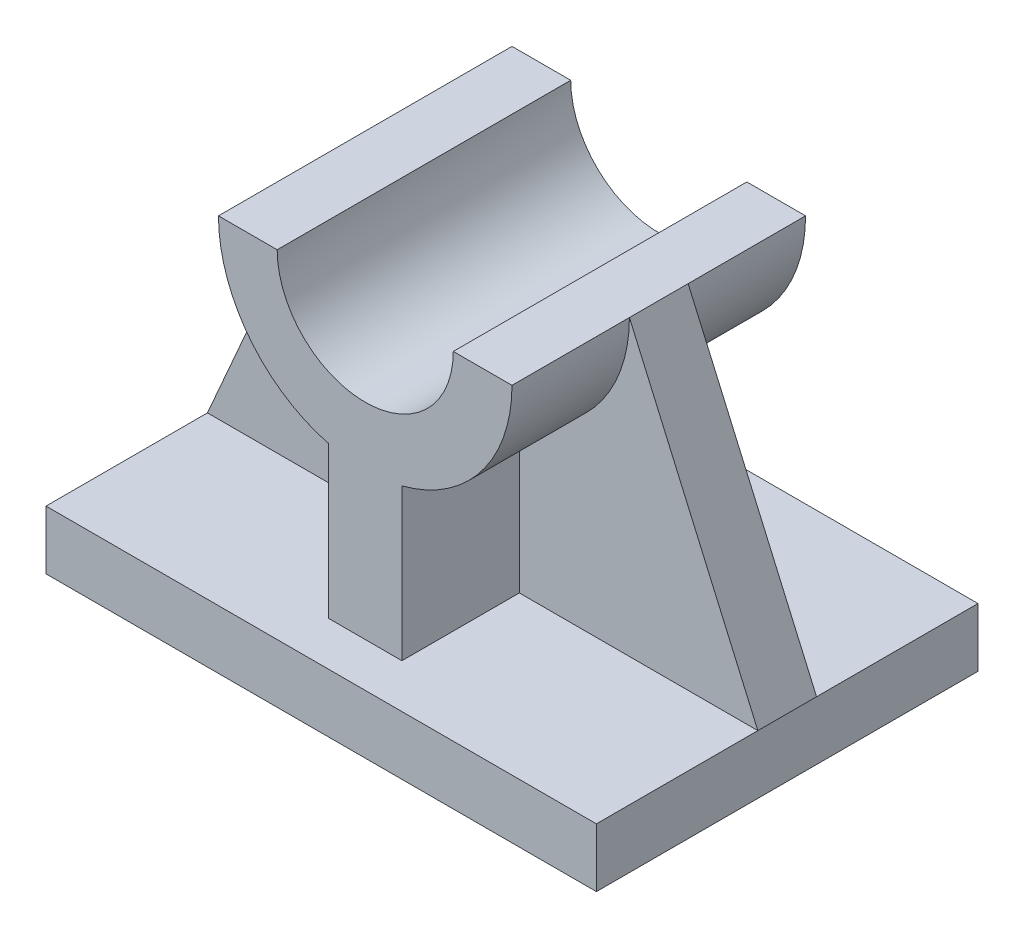
ISO-10303-21;
HEADER;
FILE_DESCRIPTION(('STEP AP214'),'2;1');
FILE_NAME('part.step','',(''),(''),'','','');
FILE_SCHEMA(('AUTOMOTIVE_DESIGN { 1 0 10303 214 1 1 1 1 }'));
ENDSEC;
DATA;
#1=APPLICATION_CONTEXT('core data for automotive mechanical design processes');
#2=APPLICATION_PROTOCOL_DEFINITION('international standard','automotive_design',2000,#1);
#3=PRODUCT_CONTEXT('',#1,'mechanical');
#4=PRODUCT('Part','Part','',(#3));
#5=PRODUCT_RELATED_PRODUCT_CATEGORY('part','',(#4));
#6=PRODUCT_DEFINITION_FORMATION('','',#4);
#7=PRODUCT_DEFINITION_CONTEXT('part definition',#1,'design');
#8=PRODUCT_DEFINITION('design','',#6,#7);
#9=PRODUCT_DEFINITION_SHAPE('','',#8);
#10=(LENGTH_UNIT() NAMED_UNIT(*) SI_UNIT(.MILLI.,.METRE.));
#11=(NAMED_UNIT(*) PLANE_ANGLE_UNIT() SI_UNIT($,.RADIAN.));
#12=(NAMED_UNIT(*) SI_UNIT($,.STERADIAN.) SOLID_ANGLE_UNIT());
#13=UNCERTAINTY_MEASURE_WITH_UNIT(LENGTH_MEASURE(1.E-05),#10,'distance_accuracy_value','');
#14=(GEOMETRIC_REPRESENTATION_CONTEXT(3) GLOBAL_UNCERTAINTY_ASSIGNED_CONTEXT((#13)) GLOBAL_UNIT_ASSIGNED_CONTEXT((#10,
#11,#12)) REPRESENTATION_CONTEXT('',''));
#15=CARTESIAN_POINT('',(0.,0.,0.));
#16=DIRECTION('',(0.,0.,1.));
#17=DIRECTION('',(1.,0.,0.));
#18=AXIS2_PLACEMENT_3D('',#15,#16,#17);
#19=CARTESIAN_POINT('',(0.,4.,26.));
#20=DIRECTION('',(0.,1.,0.));
#21=DIRECTION('',(0.,0.,1.));
#22=AXIS2_PLACEMENT_3D('',#19,#20,#21);
#23=PLANE('',#22);
#24=DIRECTION('',(0.,0.,-1.));
#25=VECTOR('',#24,1.);
#26=CARTESIAN_POINT('',(-37.5,4.,26.));
#27=LINE('',#26,#25);
#28=CARTESIAN_POINT('',(-37.5,4.,-3.99999999999999));
#29=VERTEX_POINT('',#28);
#30=CARTESIAN_POINT('',(-37.5,4.,-26.));
#31=VERTEX_POINT('',#30);
#32=EDGE_CURVE('E56',#29,#31,#27,.T.);
#33=ORIENTED_EDGE('',*,*,#32,.F.);
#34=DIRECTION('',(1.,0.,0.));
#35=VECTOR('',#34,1.);
#36=CARTESIAN_POINT('',(0.,4.,-4.));
#37=LINE('',#36,#35);
#38=CARTESIAN_POINT('',(-5.,4.,-4.));
#39=VERTEX_POINT('',#38);
#40=EDGE_CURVE('E192',#29,#39,#37,.T.);
#41=ORIENTED_EDGE('',*,*,#40,.T.);
#42=DIRECTION('',(0.,0.,-1.));
#43=VECTOR('',#42,1.);
#44=CARTESIAN_POINT('',(-5.,4.,20.));
#45=LINE('',#44,#43);
#46=CARTESIAN_POINT('',(-5.,4.,-20.));
#47=VERTEX_POINT('',#46);
#48=EDGE_CURVE('E179',#39,#47,#45,.T.);
#49=ORIENTED_EDGE('',*,*,#48,.T.);
#50=DIRECTION('',(1.,0.,0.));
#51=VECTOR('',#50,1.);
#52=CARTESIAN_POINT('',(0.,4.,-20.));
#53=LINE('',#52,#51);
#54=CARTESIAN_POINT('',(5.,4.,-20.));
#55=VERTEX_POINT('',#54);
#56=EDGE_CURVE('E243',#47,#55,#53,.T.);
#57=ORIENTED_EDGE('',*,*,#56,.T.);
#58=DIRECTION('',(0.,0.,-1.));
#59=VECTOR('',#58,1.);
#60=CARTESIAN_POINT('',(5.,4.,20.));
#61=LINE('',#60,#59);
#62=CARTESIAN_POINT('',(5.,4.,-4.));
#63=VERTEX_POINT('',#62);
#64=EDGE_CURVE('E259',#63,#55,#61,.T.);
#65=ORIENTED_EDGE('',*,*,#64,.F.);
#66=DIRECTION('',(1.,0.,0.));
#67=VECTOR('',#66,1.);
#68=CARTESIAN_POINT('',(0.,4.,-4.));
#69=LINE('',#68,#67);
#70=CARTESIAN_POINT('',(37.5,4.,-4.));
#71=VERTEX_POINT('',#70);
#72=EDGE_CURVE('E229',#63,#71,#69,.T.);
#73=ORIENTED_EDGE('',*,*,#72,.T.);
#74=DIRECTION('',(0.,0.,-1.));
#75=VECTOR('',#74,1.);
#76=CARTESIAN_POINT('',(37.5,4.,26.));
#77=LINE('',#76,#75);
#78=CARTESIAN_POINT('',(37.5,4.,-26.));
#79=VERTEX_POINT('',#78);
#80=EDGE_CURVE('E325',#71,#79,#77,.T.);
#81=ORIENTED_EDGE('',*,*,#80,.T.);
#82=DIRECTION('',(1.,0.,0.));
#83=VECTOR('',#82,1.);
#84=CARTESIAN_POINT('',(0.,4.,-26.));
#85=LINE('',#84,#83);
#86=EDGE_CURVE('E318',#31,#79,#85,.T.);
#87=ORIENTED_EDGE('',*,*,#86,.F.);
#88=EDGE_LOOP('',(#33,#41,#49,#57,#65,#73,#81,#87));
#89=FACE_BOUND('',#88,.T.);
#90=ADVANCED_FACE('F41',(#89),#23,.T.);
#91=CARTESIAN_POINT('',(0.,44.,20.));
#92=DIRECTION('',(0.,0.,-1.));
#93=DIRECTION('',(-1.,0.,0.));
#94=AXIS2_PLACEMENT_3D('',#91,#92,#93);
#95=CYLINDRICAL_SURFACE('',#94,20.);
#96=CARTESIAN_POINT('',(0.,44.,-4.));
#97=DIRECTION('',(0.,0.,1.));
#98=DIRECTION('',(1.,0.,0.));
#99=AXIS2_PLACEMENT_3D('',#96,#97,#98);
#100=CIRCLE('',#99,20.);
#101=CARTESIAN_POINT('',(-20.,44.,-4.));
#102=VERTEX_POINT('',#101);
#103=CARTESIAN_POINT('',(-5.,24.6350832689629,-4.));
#104=VERTEX_POINT('',#103);
#105=EDGE_CURVE('E200',#102,#104,#100,.T.);
#106=ORIENTED_EDGE('',*,*,#105,.F.);
#107=DIRECTION('',(0.,0.,-1.));
#108=VECTOR('',#107,1.);
#109=CARTESIAN_POINT('',(-20.,44.,20.));
#110=LINE('',#109,#108);
#111=CARTESIAN_POINT('',(-20.,44.,-20.));
#112=VERTEX_POINT('',#111);
#113=EDGE_CURVE('E283',#102,#112,#110,.T.);
#114=ORIENTED_EDGE('',*,*,#113,.T.);
#115=CARTESIAN_POINT('',(0.,44.,-20.));
#116=DIRECTION('',(0.,0.,1.));
#117=DIRECTION('',(1.,0.,0.));
#118=AXIS2_PLACEMENT_3D('',#115,#116,#117);
#119=CIRCLE('',#118,20.);
#120=CARTESIAN_POINT('',(-5.,24.6350832689629,-20.));
#121=VERTEX_POINT('',#120);
#122=EDGE_CURVE('E266',#112,#121,#119,.T.);
#123=ORIENTED_EDGE('',*,*,#122,.T.);
#124=DIRECTION('',(0.,0.,-1.));
#125=VECTOR('',#124,1.);
#126=CARTESIAN_POINT('',(-5.,24.6350832689629,20.));
#127=LINE('',#126,#125);
#128=EDGE_CURVE('E279',#104,#121,#127,.T.);
#129=ORIENTED_EDGE('',*,*,#128,.F.);
#130=EDGE_LOOP('',(#106,#114,#123,#129));
#131=FACE_BOUND('',#130,.T.);
#132=ADVANCED_FACE('F390',(#131),#95,.T.);
#133=CARTESIAN_POINT('',(-5.,0.,20.));
#134=DIRECTION('',(1.,0.,0.));
#135=DIRECTION('',(0.,1.,0.));
#136=AXIS2_PLACEMENT_3D('',#133,#134,#135);
#137=PLANE('',#136);
#138=DIRECTION('',(0.,-1.,0.));
#139=VECTOR('',#138,1.);
#140=CARTESIAN_POINT('',(-5.,0.,-4.));
#141=LINE('',#140,#139);
#142=EDGE_CURVE('E182',#104,#39,#141,.T.);
#143=ORIENTED_EDGE('',*,*,#142,.F.);
#144=ORIENTED_EDGE('',*,*,#128,.T.);
#145=DIRECTION('',(0.,-1.,0.));
#146=VECTOR('',#145,1.);
#147=CARTESIAN_POINT('',(-5.,0.,-20.));
#148=LINE('',#147,#146);
#149=EDGE_CURVE('E185',#121,#47,#148,.T.);
#150=ORIENTED_EDGE('',*,*,#149,.T.);
#151=ORIENTED_EDGE('',*,*,#48,.F.);
#152=EDGE_LOOP('',(#143,#144,#150,#151));
#153=FACE_BOUND('',#152,.T.);
#154=ADVANCED_FACE('F180',(#153),#137,.F.);
#155=CARTESIAN_POINT('',(5.,0.,20.));
#156=DIRECTION('',(1.,0.,0.));
#157=DIRECTION('',(0.,1.,0.));
#158=AXIS2_PLACEMENT_3D('',#155,#156,#157);
#159=PLANE('',#158);
#160=DIRECTION('',(0.,0.,-1.));
#161=VECTOR('',#160,1.);
#162=CARTESIAN_POINT('',(5.,24.6350832689629,20.));
#163=LINE('',#162,#161);
#164=CARTESIAN_POINT('',(5.,24.6350832689629,-4.));
#165=VERTEX_POINT('',#164);
#166=CARTESIAN_POINT('',(5.,24.6350832689629,-20.));
#167=VERTEX_POINT('',#166);
#168=EDGE_CURVE('E295',#165,#167,#163,.T.);
#169=ORIENTED_EDGE('',*,*,#168,.F.);
#170=DIRECTION('',(0.,-1.,0.));
#171=VECTOR('',#170,1.);
#172=CARTESIAN_POINT('',(5.,0.,-4.));
#173=LINE('',#172,#171);
#174=EDGE_CURVE('E226',#165,#63,#173,.T.);
#175=ORIENTED_EDGE('',*,*,#174,.T.);
#176=ORIENTED_EDGE('',*,*,#64,.T.);
#177=DIRECTION('',(0.,-1.,0.));
#178=VECTOR('',#177,1.);
#179=CARTESIAN_POINT('',(5.,0.,-20.));
#180=LINE('',#179,#178);
#181=EDGE_CURVE('E238',#167,#55,#180,.T.);
#182=ORIENTED_EDGE('',*,*,#181,.F.);
#183=EDGE_LOOP('',(#169,#175,#176,#182));
#184=FACE_BOUND('',#183,.T.);
#185=ADVANCED_FACE('F420',(#184),#159,.T.);
#186=CARTESIAN_POINT('',(0.,44.,-4.));
#187=DIRECTION('',(0.,0.,1.));
#188=DIRECTION('',(1.,0.,0.));
#189=AXIS2_PLACEMENT_3D('',#186,#187,#188);
#190=CIRCLE('',#189,20.);
#191=CARTESIAN_POINT('',(20.,44.,-4.));
#192=VERTEX_POINT('',#191);
#193=EDGE_CURVE('E213',#165,#192,#190,.T.);
#194=ORIENTED_EDGE('',*,*,#193,.F.);
#195=ORIENTED_EDGE('',*,*,#168,.T.);
#196=CARTESIAN_POINT('',(20.,44.,-20.));
#197=VERTEX_POINT('',#196);
#198=EDGE_CURVE('E262',#167,#197,#119,.T.);
#199=ORIENTED_EDGE('',*,*,#198,.T.);
#200=DIRECTION('',(0.,0.,-1.));
#201=VECTOR('',#200,1.);
#202=CARTESIAN_POINT('',(20.,44.,20.));
#203=LINE('',#202,#201);
#204=EDGE_CURVE('E291',#192,#197,#203,.T.);
#205=ORIENTED_EDGE('',*,*,#204,.F.);
#206=EDGE_LOOP('',(#194,#195,#199,#205));
#207=FACE_BOUND('',#206,.T.);
#208=ADVANCED_FACE('F399',(#207),#95,.T.);
#209=CARTESIAN_POINT('',(0.,-4.,26.));
#210=DIRECTION('',(0.,1.,0.));
#211=DIRECTION('',(0.,0.,1.));
#212=AXIS2_PLACEMENT_3D('',#209,#210,#211);
#213=PLANE('',#212);
#214=DIRECTION('',(1.,0.,0.));
#215=VECTOR('',#214,1.);
#216=CARTESIAN_POINT('',(0.,-4.,-26.));
#217=LINE('',#216,#215);
#218=CARTESIAN_POINT('',(-37.5,-4.,-26.));
#219=VERTEX_POINT('',#218);
#220=CARTESIAN_POINT('',(37.5,-4.,-26.));
#221=VERTEX_POINT('',#220);
#222=EDGE_CURVE('E299',#219,#221,#217,.T.);
#223=ORIENTED_EDGE('',*,*,#222,.T.);
#224=DIRECTION('',(0.,0.,-1.));
#225=VECTOR('',#224,1.);
#226=CARTESIAN_POINT('',(37.5,-4.,26.));
#227=LINE('',#226,#225);
#228=CARTESIAN_POINT('',(37.5,-4.,26.));
#229=VERTEX_POINT('',#228);
#230=EDGE_CURVE('E11',#229,#221,#227,.T.);
#231=ORIENTED_EDGE('',*,*,#230,.F.);
#232=DIRECTION('',(1.,0.,0.));
#233=VECTOR('',#232,1.);
#234=CARTESIAN_POINT('',(0.,-4.,26.));
#235=LINE('',#234,#233);
#236=CARTESIAN_POINT('',(-37.5,-4.,26.));
#237=VERTEX_POINT('',#236);
#238=EDGE_CURVE('E300',#237,#229,#235,.T.);
#239=ORIENTED_EDGE('',*,*,#238,.F.);
#240=DIRECTION('',(0.,0.,-1.));
#241=VECTOR('',#240,1.);
#242=CARTESIAN_POINT('',(-37.5,-4.,26.));
#243=LINE('',#242,#241);
#244=EDGE_CURVE('E312',#237,#219,#243,.T.);
#245=ORIENTED_EDGE('',*,*,#244,.T.);
#246=EDGE_LOOP('',(#223,#231,#239,#245));
#247=FACE_BOUND('',#246,.T.);
#248=ADVANCED_FACE('F43',(#247),#213,.F.);
#249=CARTESIAN_POINT('',(37.5,0.,26.));
#250=DIRECTION('',(-1.,0.,0.));
#251=DIRECTION('',(0.,0.,1.));
#252=AXIS2_PLACEMENT_3D('',#249,#250,#251);
#253=PLANE('',#252);
#254=DIRECTION('',(0.,1.,0.));
#255=VECTOR('',#254,1.);
#256=CARTESIAN_POINT('',(37.5,0.,-26.));
#257=LINE('',#256,#255);
#258=EDGE_CURVE('E315',#221,#79,#257,.T.);
#259=ORIENTED_EDGE('',*,*,#258,.T.);
#260=ORIENTED_EDGE('',*,*,#80,.F.);
#261=DIRECTION('',(0.,0.,-1.));
#262=VECTOR('',#261,1.);
#263=CARTESIAN_POINT('',(37.5,4.,4.));
#264=LINE('',#263,#262);
#265=CARTESIAN_POINT('',(37.5,4.,4.));
#266=VERTEX_POINT('',#265);
#267=EDGE_CURVE('E236',#266,#71,#264,.T.);
#268=ORIENTED_EDGE('',*,*,#267,.F.);
#269=CARTESIAN_POINT('',(37.5,4.,26.));
#270=VERTEX_POINT('',#269);
#271=EDGE_CURVE('E49',#270,#266,#77,.T.);
#272=ORIENTED_EDGE('',*,*,#271,.F.);
#273=DIRECTION('',(0.,1.,0.));
#274=VECTOR('',#273,1.);
#275=CARTESIAN_POINT('',(37.5,0.,26.));
#276=LINE('',#275,#274);
#277=EDGE_CURVE('E303',#229,#270,#276,.T.);
#278=ORIENTED_EDGE('',*,*,#277,.F.);
#279=ORIENTED_EDGE('',*,*,#230,.T.);
#280=EDGE_LOOP('',(#259,#260,#268,#272,#278,#279));
#281=FACE_BOUND('',#280,.T.);
#282=ADVANCED_FACE('F333',(#281),#253,.F.);
#283=DIRECTION('',(1.,0.,0.));
#284=VECTOR('',#283,1.);
#285=CARTESIAN_POINT('',(0.,4.,4.));
#286=LINE('',#285,#284);
#287=CARTESIAN_POINT('',(-37.5,4.,4.00000000000001));
#288=VERTEX_POINT('',#287);
#289=CARTESIAN_POINT('',(-5.,4.,4.));
#290=VERTEX_POINT('',#289);
#291=EDGE_CURVE('E64',#288,#290,#286,.T.);
#292=ORIENTED_EDGE('',*,*,#291,.F.);
#293=CARTESIAN_POINT('',(-37.5,4.,26.));
#294=VERTEX_POINT('',#293);
#295=EDGE_CURVE('E324',#294,#288,#27,.T.);
#296=ORIENTED_EDGE('',*,*,#295,.F.);
#297=DIRECTION('',(1.,0.,0.));
#298=VECTOR('',#297,1.);
#299=CARTESIAN_POINT('',(0.,4.,26.));
#300=LINE('',#299,#298);
#301=EDGE_CURVE('E306',#294,#270,#300,.T.);
#302=ORIENTED_EDGE('',*,*,#301,.T.);
#303=ORIENTED_EDGE('',*,*,#271,.T.);
#304=DIRECTION('',(1.,0.,0.));
#305=VECTOR('',#304,1.);
#306=CARTESIAN_POINT('',(0.,4.,4.));
#307=LINE('',#306,#305);
#308=CARTESIAN_POINT('',(5.,4.,4.));
#309=VERTEX_POINT('',#308);
#310=EDGE_CURVE('E220',#309,#266,#307,.T.);
#311=ORIENTED_EDGE('',*,*,#310,.F.);
#312=CARTESIAN_POINT('',(5.,4.,20.));
#313=VERTEX_POINT('',#312);
#314=EDGE_CURVE('E189',#313,#309,#61,.T.);
#315=ORIENTED_EDGE('',*,*,#314,.F.);
#316=DIRECTION('',(1.,0.,0.));
#317=VECTOR('',#316,1.);
#318=CARTESIAN_POINT('',(0.,4.,20.));
#319=LINE('',#318,#317);
#320=CARTESIAN_POINT('',(-5.,4.,20.));
#321=VERTEX_POINT('',#320);
#322=EDGE_CURVE('E257',#321,#313,#319,.T.);
#323=ORIENTED_EDGE('',*,*,#322,.F.);
#324=EDGE_CURVE('E188',#321,#290,#45,.T.);
#325=ORIENTED_EDGE('',*,*,#324,.T.);
#326=EDGE_LOOP('',(#292,#296,#302,#303,#311,#315,#323,#325));
#327=FACE_BOUND('',#326,.T.);
#328=ADVANCED_FACE('F361',(#327),#23,.T.);
#329=CARTESIAN_POINT('',(-37.5,0.,26.));
#330=DIRECTION('',(-1.,0.,0.));
#331=DIRECTION('',(0.,0.,1.));
#332=AXIS2_PLACEMENT_3D('',#329,#330,#331);
#333=PLANE('',#332);
#334=DIRECTION('',(0.,1.,0.));
#335=VECTOR('',#334,1.);
#336=CARTESIAN_POINT('',(-37.5,0.,-26.));
#337=LINE('',#336,#335);
#338=EDGE_CURVE('E304',#219,#31,#337,.T.);
#339=ORIENTED_EDGE('',*,*,#338,.F.);
#340=ORIENTED_EDGE('',*,*,#244,.F.);
#341=DIRECTION('',(0.,1.,0.));
#342=VECTOR('',#341,1.);
#343=CARTESIAN_POINT('',(-37.5,0.,26.));
#344=LINE('',#343,#342);
#345=EDGE_CURVE('E309',#237,#294,#344,.T.);
#346=ORIENTED_EDGE('',*,*,#345,.T.);
#347=ORIENTED_EDGE('',*,*,#295,.T.);
#348=DIRECTION('',(0.,0.,-1.));
#349=VECTOR('',#348,1.);
#350=CARTESIAN_POINT('',(-37.5,4.,4.));
#351=LINE('',#350,#349);
#352=EDGE_CURVE('E207',#288,#29,#351,.T.);
#353=ORIENTED_EDGE('',*,*,#352,.T.);
#354=ORIENTED_EDGE('',*,*,#32,.T.);
#355=EDGE_LOOP('',(#339,#340,#346,#347,#353,#354));
#356=FACE_BOUND('',#355,.T.);
#357=ADVANCED_FACE('F340',(#356),#333,.T.);
#358=CARTESIAN_POINT('',(0.,0.,26.));
#359=DIRECTION('',(0.,0.,1.));
#360=DIRECTION('',(1.,0.,0.));
#361=AXIS2_PLACEMENT_3D('',#358,#359,#360);
#362=PLANE('',#361);
#363=ORIENTED_EDGE('',*,*,#238,.T.);
#364=ORIENTED_EDGE('',*,*,#277,.T.);
#365=ORIENTED_EDGE('',*,*,#301,.F.);
#366=ORIENTED_EDGE('',*,*,#345,.F.);
#367=EDGE_LOOP('',(#363,#364,#365,#366));
#368=FACE_BOUND('',#367,.T.);
#369=ADVANCED_FACE('F412',(#368),#362,.T.);
#370=CARTESIAN_POINT('',(0.,0.,-26.));
#371=DIRECTION('',(0.,0.,1.));
#372=DIRECTION('',(1.,0.,0.));
#373=AXIS2_PLACEMENT_3D('',#370,#371,#372);
#374=PLANE('',#373);
#375=ORIENTED_EDGE('',*,*,#222,.F.);
#376=ORIENTED_EDGE('',*,*,#338,.T.);
#377=ORIENTED_EDGE('',*,*,#86,.T.);
#378=ORIENTED_EDGE('',*,*,#258,.F.);
#379=EDGE_LOOP('',(#375,#376,#377,#378));
#380=FACE_BOUND('',#379,.T.);
#381=ADVANCED_FACE('F337',(#380),#374,.F.);
#382=DIRECTION('',(0.,-1.,0.));
#383=VECTOR('',#382,1.);
#384=CARTESIAN_POINT('',(5.,0.,4.));
#385=LINE('',#384,#383);
#386=CARTESIAN_POINT('',(5.,24.6350832689629,4.));
#387=VERTEX_POINT('',#386);
#388=EDGE_CURVE('E217',#387,#309,#385,.T.);
#389=ORIENTED_EDGE('',*,*,#388,.F.);
#390=CARTESIAN_POINT('',(5.,24.6350832689629,20.));
#391=VERTEX_POINT('',#390);
#392=EDGE_CURVE('E296',#391,#387,#163,.T.);
#393=ORIENTED_EDGE('',*,*,#392,.F.);
#394=DIRECTION('',(0.,-1.,0.));
#395=VECTOR('',#394,1.);
#396=CARTESIAN_POINT('',(5.,0.,20.));
#397=LINE('',#396,#395);
#398=EDGE_CURVE('E239',#391,#313,#397,.T.);
#399=ORIENTED_EDGE('',*,*,#398,.T.);
#400=ORIENTED_EDGE('',*,*,#314,.T.);
#401=EDGE_LOOP('',(#389,#393,#399,#400));
#402=FACE_BOUND('',#401,.T.);
#403=ADVANCED_FACE('F368',(#402),#159,.T.);
#404=ORIENTED_EDGE('',*,*,#392,.T.);
#405=CARTESIAN_POINT('',(0.,44.,4.));
#406=DIRECTION('',(0.,0.,1.));
#407=DIRECTION('',(1.,0.,0.));
#408=AXIS2_PLACEMENT_3D('',#405,#406,#407);
#409=CIRCLE('',#408,20.);
#410=CARTESIAN_POINT('',(20.,44.,4.));
#411=VERTEX_POINT('',#410);
#412=EDGE_CURVE('E214',#387,#411,#409,.T.);
#413=ORIENTED_EDGE('',*,*,#412,.T.);
#414=CARTESIAN_POINT('',(20.,44.,20.));
#415=VERTEX_POINT('',#414);
#416=EDGE_CURVE('E292',#415,#411,#203,.T.);
#417=ORIENTED_EDGE('',*,*,#416,.F.);
#418=CARTESIAN_POINT('',(0.,44.,20.));
#419=DIRECTION('',(0.,0.,1.));
#420=DIRECTION('',(1.,0.,0.));
#421=AXIS2_PLACEMENT_3D('',#418,#419,#420);
#422=CIRCLE('',#421,20.);
#423=EDGE_CURVE('E242',#391,#415,#422,.T.);
#424=ORIENTED_EDGE('',*,*,#423,.F.);
#425=EDGE_LOOP('',(#404,#413,#417,#424));
#426=FACE_BOUND('',#425,.T.);
#427=ADVANCED_FACE('F372',(#426),#95,.T.);
#428=CARTESIAN_POINT('',(0.,44.,20.));
#429=DIRECTION('',(0.,1.,0.));
#430=DIRECTION('',(0.,0.,1.));
#431=AXIS2_PLACEMENT_3D('',#428,#429,#430);
#432=PLANE('',#431);
#433=DIRECTION('',(1.,0.,0.));
#434=VECTOR('',#433,1.);
#435=CARTESIAN_POINT('',(0.,44.,-20.));
#436=LINE('',#435,#434);
#437=CARTESIAN_POINT('',(12.,44.,-20.));
#438=VERTEX_POINT('',#437);
#439=EDGE_CURVE('E265',#438,#197,#436,.T.);
#440=ORIENTED_EDGE('',*,*,#439,.F.);
#441=DIRECTION('',(0.,0.,-1.));
#442=VECTOR('',#441,1.);
#443=CARTESIAN_POINT('',(12.,44.,20.));
#444=LINE('',#443,#442);
#445=CARTESIAN_POINT('',(12.,44.,20.));
#446=VERTEX_POINT('',#445);
#447=EDGE_CURVE('E289',#446,#438,#444,.T.);
#448=ORIENTED_EDGE('',*,*,#447,.F.);
#449=DIRECTION('',(1.,0.,0.));
#450=VECTOR('',#449,1.);
#451=CARTESIAN_POINT('',(0.,44.,20.));
#452=LINE('',#451,#450);
#453=EDGE_CURVE('E245',#446,#415,#452,.T.);
#454=ORIENTED_EDGE('',*,*,#453,.T.);
#455=ORIENTED_EDGE('',*,*,#416,.T.);
#456=DIRECTION('',(0.,0.,-1.));
#457=VECTOR('',#456,1.);
#458=CARTESIAN_POINT('',(20.,44.,4.));
#459=LINE('',#458,#457);
#460=EDGE_CURVE('E224',#411,#192,#459,.T.);
#461=ORIENTED_EDGE('',*,*,#460,.T.);
#462=ORIENTED_EDGE('',*,*,#204,.T.);
#463=EDGE_LOOP('',(#440,#448,#454,#455,#461,#462));
#464=FACE_BOUND('',#463,.T.);
#465=ADVANCED_FACE('F401',(#464),#432,.T.);
#466=CARTESIAN_POINT('',(0.,44.,20.));
#467=DIRECTION('',(0.,0.,-1.));
#468=DIRECTION('',(-1.,0.,0.));
#469=AXIS2_PLACEMENT_3D('',#466,#467,#468);
#470=CYLINDRICAL_SURFACE('',#469,12.);
#471=CARTESIAN_POINT('',(0.,44.,-20.));
#472=DIRECTION('',(0.,0.,1.));
#473=DIRECTION('',(1.,0.,0.));
#474=AXIS2_PLACEMENT_3D('',#471,#472,#473);
#475=CIRCLE('',#474,12.);
#476=CARTESIAN_POINT('',(-12.,44.,-20.));
#477=VERTEX_POINT('',#476);
#478=EDGE_CURVE('E269',#477,#438,#475,.T.);
#479=ORIENTED_EDGE('',*,*,#478,.F.);
#480=DIRECTION('',(0.,0.,-1.));
#481=VECTOR('',#480,1.);
#482=CARTESIAN_POINT('',(-12.,44.,20.));
#483=LINE('',#482,#481);
#484=CARTESIAN_POINT('',(-12.,44.,20.));
#485=VERTEX_POINT('',#484);
#486=EDGE_CURVE('E287',#485,#477,#483,.T.);
#487=ORIENTED_EDGE('',*,*,#486,.F.);
#488=CARTESIAN_POINT('',(0.,44.,20.));
#489=DIRECTION('',(0.,0.,1.));
#490=DIRECTION('',(1.,0.,0.));
#491=AXIS2_PLACEMENT_3D('',#488,#489,#490);
#492=CIRCLE('',#491,12.);
#493=EDGE_CURVE('E249',#485,#446,#492,.T.);
#494=ORIENTED_EDGE('',*,*,#493,.T.);
#495=ORIENTED_EDGE('',*,*,#447,.T.);
#496=EDGE_LOOP('',(#479,#487,#494,#495));
#497=FACE_BOUND('',#496,.T.);
#498=ADVANCED_FACE('F379',(#497),#470,.F.);
#499=CARTESIAN_POINT('',(0.,44.,20.));
#500=DIRECTION('',(0.,1.,0.));
#501=DIRECTION('',(0.,0.,1.));
#502=AXIS2_PLACEMENT_3D('',#499,#500,#501);
#503=PLANE('',#502);
#504=DIRECTION('',(1.,0.,0.));
#505=VECTOR('',#504,1.);
#506=CARTESIAN_POINT('',(0.,44.,-20.));
#507=LINE('',#506,#505);
#508=EDGE_CURVE('E272',#112,#477,#507,.T.);
#509=ORIENTED_EDGE('',*,*,#508,.F.);
#510=ORIENTED_EDGE('',*,*,#113,.F.);
#511=DIRECTION('',(0.,0.,-1.));
#512=VECTOR('',#511,1.);
#513=CARTESIAN_POINT('',(-20.,44.,4.));
#514=LINE('',#513,#512);
#515=CARTESIAN_POINT('',(-20.,44.,4.));
#516=VERTEX_POINT('',#515);
#517=EDGE_CURVE('E209',#516,#102,#514,.T.);
#518=ORIENTED_EDGE('',*,*,#517,.F.);
#519=CARTESIAN_POINT('',(-20.,44.,20.));
#520=VERTEX_POINT('',#519);
#521=EDGE_CURVE('E284',#520,#516,#110,.T.);
#522=ORIENTED_EDGE('',*,*,#521,.F.);
#523=DIRECTION('',(1.,0.,0.));
#524=VECTOR('',#523,1.);
#525=CARTESIAN_POINT('',(0.,44.,20.));
#526=LINE('',#525,#524);
#527=EDGE_CURVE('E252',#520,#485,#526,.T.);
#528=ORIENTED_EDGE('',*,*,#527,.T.);
#529=ORIENTED_EDGE('',*,*,#486,.T.);
#530=EDGE_LOOP('',(#509,#510,#518,#522,#528,#529));
#531=FACE_BOUND('',#530,.T.);
#532=ADVANCED_FACE('F383',(#531),#503,.T.);
#533=ORIENTED_EDGE('',*,*,#521,.T.);
#534=CARTESIAN_POINT('',(0.,44.,4.));
#535=DIRECTION('',(0.,0.,1.));
#536=DIRECTION('',(1.,0.,0.));
#537=AXIS2_PLACEMENT_3D('',#534,#535,#536);
#538=CIRCLE('',#537,20.);
#539=CARTESIAN_POINT('',(-5.,24.6350832689629,4.));
#540=VERTEX_POINT('',#539);
#541=EDGE_CURVE('E201',#516,#540,#538,.T.);
#542=ORIENTED_EDGE('',*,*,#541,.T.);
#543=CARTESIAN_POINT('',(-5.,24.6350832689629,20.));
#544=VERTEX_POINT('',#543);
#545=EDGE_CURVE('E280',#544,#540,#127,.T.);
#546=ORIENTED_EDGE('',*,*,#545,.F.);
#547=EDGE_CURVE('E246',#520,#544,#422,.T.);
#548=ORIENTED_EDGE('',*,*,#547,.F.);
#549=EDGE_LOOP('',(#533,#542,#546,#548));
#550=FACE_BOUND('',#549,.T.);
#551=ADVANCED_FACE('F387',(#550),#95,.T.);
#552=ORIENTED_EDGE('',*,*,#545,.T.);
#553=DIRECTION('',(0.,-1.,0.));
#554=VECTOR('',#553,1.);
#555=CARTESIAN_POINT('',(-5.,0.,4.));
#556=LINE('',#555,#554);
#557=EDGE_CURVE('E210',#540,#290,#556,.T.);
#558=ORIENTED_EDGE('',*,*,#557,.T.);
#559=ORIENTED_EDGE('',*,*,#324,.F.);
#560=DIRECTION('',(0.,-1.,0.));
#561=VECTOR('',#560,1.);
#562=CARTESIAN_POINT('',(-5.,0.,20.));
#563=LINE('',#562,#561);
#564=EDGE_CURVE('E255',#544,#321,#563,.T.);
#565=ORIENTED_EDGE('',*,*,#564,.F.);
#566=EDGE_LOOP('',(#552,#558,#559,#565));
#567=FACE_BOUND('',#566,.T.);
#568=ADVANCED_FACE('F357',(#567),#137,.F.);
#569=CARTESIAN_POINT('',(0.,0.,20.));
#570=DIRECTION('',(0.,0.,1.));
#571=DIRECTION('',(1.,0.,0.));
#572=AXIS2_PLACEMENT_3D('',#569,#570,#571);
#573=PLANE('',#572);
#574=ORIENTED_EDGE('',*,*,#398,.F.);
#575=ORIENTED_EDGE('',*,*,#423,.T.);
#576=ORIENTED_EDGE('',*,*,#453,.F.);
#577=ORIENTED_EDGE('',*,*,#493,.F.);
#578=ORIENTED_EDGE('',*,*,#527,.F.);
#579=ORIENTED_EDGE('',*,*,#547,.T.);
#580=ORIENTED_EDGE('',*,*,#564,.T.);
#581=ORIENTED_EDGE('',*,*,#322,.T.);
#582=EDGE_LOOP('',(#574,#575,#576,#577,#578,#579,#580,#581));
#583=FACE_BOUND('',#582,.T.);
#584=ADVANCED_FACE('F365',(#583),#573,.T.);
#585=CARTESIAN_POINT('',(0.,0.,-20.));
#586=DIRECTION('',(0.,0.,1.));
#587=DIRECTION('',(1.,0.,0.));
#588=AXIS2_PLACEMENT_3D('',#585,#586,#587);
#589=PLANE('',#588);
#590=ORIENTED_EDGE('',*,*,#181,.T.);
#591=ORIENTED_EDGE('',*,*,#56,.F.);
#592=ORIENTED_EDGE('',*,*,#149,.F.);
#593=ORIENTED_EDGE('',*,*,#122,.F.);
#594=ORIENTED_EDGE('',*,*,#508,.T.);
#595=ORIENTED_EDGE('',*,*,#478,.T.);
#596=ORIENTED_EDGE('',*,*,#439,.T.);
#597=ORIENTED_EDGE('',*,*,#198,.F.);
#598=EDGE_LOOP('',(#590,#591,#592,#593,#594,#595,#596,#597));
#599=FACE_BOUND('',#598,.T.);
#600=ADVANCED_FACE('F439',(#599),#589,.F.);
#601=CARTESIAN_POINT('',(32.944262295082,14.4131147540984,4.));
#602=DIRECTION('',(-0.916157334902189,-0.400818834019708,0.));
#603=DIRECTION('',(0.400818834019708,-0.916157334902189,0.));
#604=AXIS2_PLACEMENT_3D('',#601,#602,#603);
#605=PLANE('',#604);
#606=DIRECTION('',(-0.400818834019708,0.916157334902189,0.));
#607=VECTOR('',#606,1.);
#608=CARTESIAN_POINT('',(32.944262295082,14.4131147540984,-4.));
#609=LINE('',#608,#607);
#610=EDGE_CURVE('E218',#71,#192,#609,.T.);
#611=ORIENTED_EDGE('',*,*,#610,.T.);
#612=ORIENTED_EDGE('',*,*,#460,.F.);
#613=DIRECTION('',(-0.400818834019708,0.916157334902189,0.));
#614=VECTOR('',#613,1.);
#615=CARTESIAN_POINT('',(32.944262295082,14.4131147540984,4.));
#616=LINE('',#615,#614);
#617=EDGE_CURVE('E222',#266,#411,#616,.T.);
#618=ORIENTED_EDGE('',*,*,#617,.F.);
#619=ORIENTED_EDGE('',*,*,#267,.T.);
#620=EDGE_LOOP('',(#611,#612,#618,#619));
#621=FACE_BOUND('',#620,.T.);
#622=ADVANCED_FACE('F428',(#621),#605,.F.);
#623=CARTESIAN_POINT('',(0.,0.,4.));
#624=DIRECTION('',(0.,0.,1.));
#625=DIRECTION('',(1.,0.,0.));
#626=AXIS2_PLACEMENT_3D('',#623,#624,#625);
#627=PLANE('',#626);
#628=ORIENTED_EDGE('',*,*,#412,.F.);
#629=ORIENTED_EDGE('',*,*,#388,.T.);
#630=ORIENTED_EDGE('',*,*,#310,.T.);
#631=ORIENTED_EDGE('',*,*,#617,.T.);
#632=EDGE_LOOP('',(#628,#629,#630,#631));
#633=FACE_BOUND('',#632,.T.);
#634=ADVANCED_FACE('F441',(#633),#627,.T.);
#635=CARTESIAN_POINT('',(0.,0.,-4.));
#636=DIRECTION('',(0.,0.,1.));
#637=DIRECTION('',(1.,0.,0.));
#638=AXIS2_PLACEMENT_3D('',#635,#636,#637);
#639=PLANE('',#638);
#640=ORIENTED_EDGE('',*,*,#193,.T.);
#641=ORIENTED_EDGE('',*,*,#610,.F.);
#642=ORIENTED_EDGE('',*,*,#72,.F.);
#643=ORIENTED_EDGE('',*,*,#174,.F.);
#644=EDGE_LOOP('',(#640,#641,#642,#643));
#645=FACE_BOUND('',#644,.T.);
#646=ADVANCED_FACE('F432',(#645),#639,.F.);
#647=CARTESIAN_POINT('',(-32.944262295082,14.4131147540984,4.));
#648=DIRECTION('',(-0.916157334902189,0.400818834019708,0.));
#649=DIRECTION('',(-0.400818834019708,-0.916157334902189,0.));
#650=AXIS2_PLACEMENT_3D('',#647,#648,#649);
#651=PLANE('',#650);
#652=DIRECTION('',(0.400818834019708,0.916157334902189,0.));
#653=VECTOR('',#652,1.);
#654=CARTESIAN_POINT('',(-32.944262295082,14.4131147540984,-4.));
#655=LINE('',#654,#653);
#656=EDGE_CURVE('E196',#29,#102,#655,.T.);
#657=ORIENTED_EDGE('',*,*,#656,.F.);
#658=ORIENTED_EDGE('',*,*,#352,.F.);
#659=DIRECTION('',(0.400818834019708,0.916157334902189,0.));
#660=VECTOR('',#659,1.);
#661=CARTESIAN_POINT('',(-32.944262295082,14.4131147540984,4.));
#662=LINE('',#661,#660);
#663=EDGE_CURVE('E203',#288,#516,#662,.T.);
#664=ORIENTED_EDGE('',*,*,#663,.T.);
#665=ORIENTED_EDGE('',*,*,#517,.T.);
#666=EDGE_LOOP('',(#657,#658,#664,#665));
#667=FACE_BOUND('',#666,.T.);
#668=ADVANCED_FACE('F346',(#667),#651,.T.);
#669=CARTESIAN_POINT('',(0.,0.,4.));
#670=DIRECTION('',(0.,0.,1.));
#671=DIRECTION('',(1.,0.,0.));
#672=AXIS2_PLACEMENT_3D('',#669,#670,#671);
#673=PLANE('',#672);
#674=ORIENTED_EDGE('',*,*,#541,.F.);
#675=ORIENTED_EDGE('',*,*,#663,.F.);
#676=ORIENTED_EDGE('',*,*,#291,.T.);
#677=ORIENTED_EDGE('',*,*,#557,.F.);
#678=EDGE_LOOP('',(#674,#675,#676,#677));
#679=FACE_BOUND('',#678,.T.);
#680=ADVANCED_FACE('F349',(#679),#673,.T.);
#681=CARTESIAN_POINT('',(0.,0.,-4.));
#682=DIRECTION('',(0.,0.,1.));
#683=DIRECTION('',(1.,0.,0.));
#684=AXIS2_PLACEMENT_3D('',#681,#682,#683);
#685=PLANE('',#684);
#686=ORIENTED_EDGE('',*,*,#105,.T.);
#687=ORIENTED_EDGE('',*,*,#142,.T.);
#688=ORIENTED_EDGE('',*,*,#40,.F.);
#689=ORIENTED_EDGE('',*,*,#656,.T.);
#690=EDGE_LOOP('',(#686,#687,#688,#689));
#691=FACE_BOUND('',#690,.T.);
#692=ADVANCED_FACE('F199',(#691),#685,.F.);
#693=CLOSED_SHELL('',(#90,#132,#154,#185,#208,#248,#282,#328,#357,#369,#381,#403,#427,#465,#498,
#532,#551,#568,#584,#600,#622,#634,#646,#668,#680,#692));
#694=MANIFOLD_SOLID_BREP('B2',#693);
#695=ADVANCED_BREP_SHAPE_REPRESENTATION('',(#18,#694),#14);
#696=SHAPE_DEFINITION_REPRESENTATION(#9,#695);
ENDSEC;
END-ISO-10303-21;
